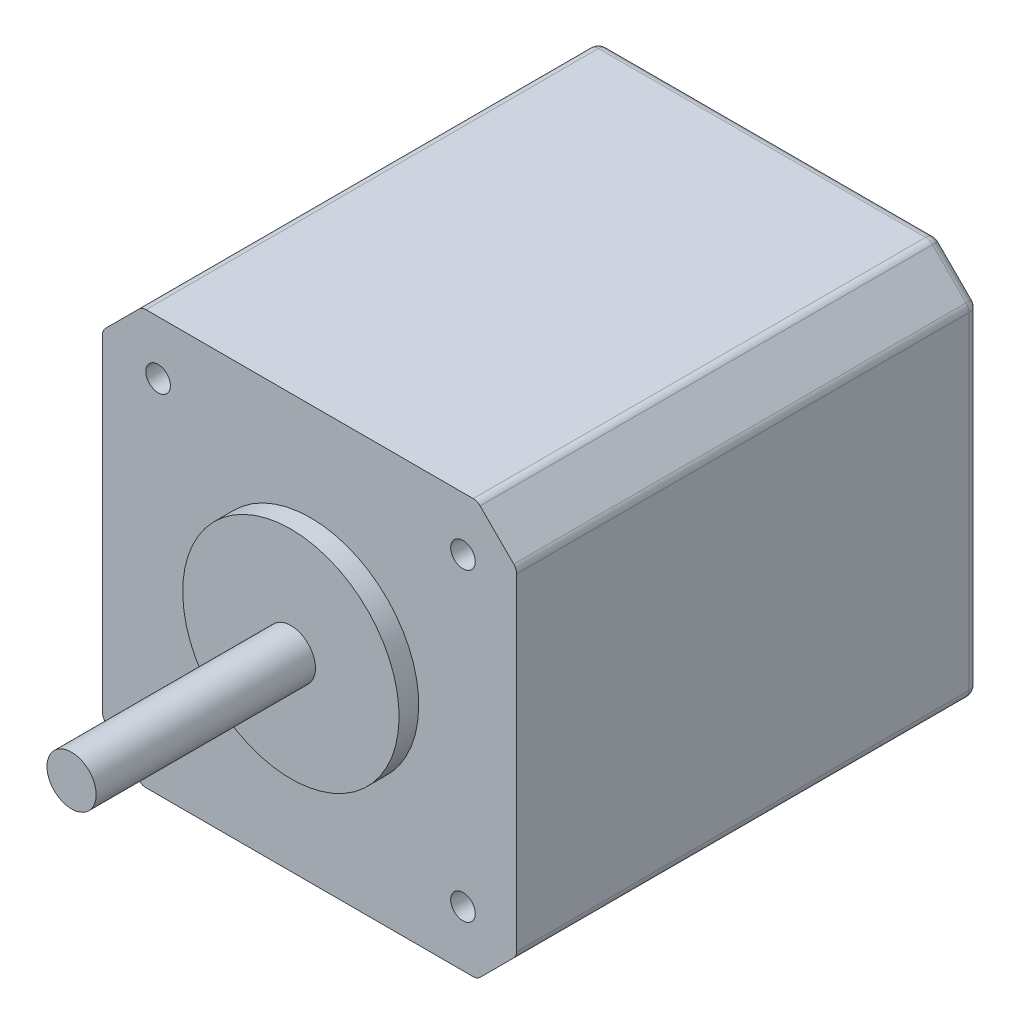
ISO-10303-21;
HEADER;
FILE_DESCRIPTION(('STEP AP214'),'2;1');
FILE_NAME('part.step','',(''),(''),'','','');
FILE_SCHEMA(('AUTOMOTIVE_DESIGN { 1 0 10303 214 1 1 1 1 }'));
ENDSEC;
DATA;
#1=APPLICATION_CONTEXT('core data for automotive mechanical design processes');
#2=APPLICATION_PROTOCOL_DEFINITION('international standard','automotive_design',2000,#1);
#3=PRODUCT_CONTEXT('',#1,'mechanical');
#4=PRODUCT('Part','Part','',(#3));
#5=PRODUCT_RELATED_PRODUCT_CATEGORY('part','',(#4));
#6=PRODUCT_DEFINITION_FORMATION('','',#4);
#7=PRODUCT_DEFINITION_CONTEXT('part definition',#1,'design');
#8=PRODUCT_DEFINITION('design','',#6,#7);
#9=PRODUCT_DEFINITION_SHAPE('','',#8);
#10=(LENGTH_UNIT() NAMED_UNIT(*) SI_UNIT(.MILLI.,.METRE.));
#11=(NAMED_UNIT(*) PLANE_ANGLE_UNIT() SI_UNIT($,.RADIAN.));
#12=(NAMED_UNIT(*) SI_UNIT($,.STERADIAN.) SOLID_ANGLE_UNIT());
#13=UNCERTAINTY_MEASURE_WITH_UNIT(LENGTH_MEASURE(1.E-05),#10,'distance_accuracy_value','');
#14=(GEOMETRIC_REPRESENTATION_CONTEXT(3) GLOBAL_UNCERTAINTY_ASSIGNED_CONTEXT((#13)) GLOBAL_UNIT_ASSIGNED_CONTEXT((#10,
#11,#12)) REPRESENTATION_CONTEXT('',''));
#15=CARTESIAN_POINT('',(0.,0.,0.));
#16=DIRECTION('',(0.,0.,1.));
#17=DIRECTION('',(1.,0.,0.));
#18=AXIS2_PLACEMENT_3D('',#15,#16,#17);
#19=CARTESIAN_POINT('',(18.62,18.62,71.3));
#20=DIRECTION('',(0.,0.,1.));
#21=DIRECTION('',(1.,0.,0.));
#22=AXIS2_PLACEMENT_3D('',#19,#20,#21);
#23=PLANE('',#22);
#24=CARTESIAN_POINT('',(21.15,21.15,71.3));
#25=DIRECTION('',(0.,0.,-1.));
#26=DIRECTION('',(-1.,0.,0.));
#27=AXIS2_PLACEMENT_3D('',#24,#25,#26);
#28=CIRCLE('',#27,2.5);
#29=CARTESIAN_POINT('',(18.65,21.15,71.3));
#30=VERTEX_POINT('',#29);
#31=EDGE_CURVE('E20',#30,#30,#28,.F.);
#32=ORIENTED_EDGE('',*,*,#31,.T.);
#33=EDGE_LOOP('',(#32));
#34=FACE_BOUND('',#33,.T.);
#35=ADVANCED_FACE('F16',(#34),#23,.T.);
#36=CARTESIAN_POINT('',(4.4142135623731,1.,1.00000000037309));
#37=DIRECTION('',(0.,0.,1.));
#38=DIRECTION('',(-1.,0.,0.));
#39=AXIS2_PLACEMENT_3D('',#36,#37,#38);
#40=SPHERICAL_SURFACE('',#39,1.);
#41=CARTESIAN_POINT('',(4.4142135625166,0.999999999515593,1.));
#42=DIRECTION('',(0.707106781187048,-0.707106781186047,0.));
#43=DIRECTION('',(0.707106781186044,0.707106781187051,0.));
#44=AXIS2_PLACEMENT_3D('',#41,#42,#43);
#45=CIRCLE('',#44,1.00000000042052);
#46=CARTESIAN_POINT('',(3.70710678096166,0.29289321871116,1.));
#47=VERTEX_POINT('',#46);
#48=CARTESIAN_POINT('',(4.41421356245348,0.999999999085498,-2.10262417285974E-10));
#49=VERTEX_POINT('',#48);
#50=EDGE_CURVE('E341',#47,#49,#45,.T.);
#51=ORIENTED_EDGE('',*,*,#50,.T.);
#52=CARTESIAN_POINT('',(4.414213562,1.,1.));
#53=DIRECTION('',(-1.,0.,0.));
#54=DIRECTION('',(0.,0.,1.));
#55=AXIS2_PLACEMENT_3D('',#52,#53,#54);
#56=CIRCLE('',#55,1.);
#57=CARTESIAN_POINT('',(4.41421356209617,0.,1.));
#58=VERTEX_POINT('',#57);
#59=EDGE_CURVE('E357',#49,#58,#56,.T.);
#60=ORIENTED_EDGE('',*,*,#59,.T.);
#61=CARTESIAN_POINT('',(4.414213562,1.,1.));
#62=DIRECTION('',(0.,0.,-1.));
#63=DIRECTION('',(-1.,0.,0.));
#64=AXIS2_PLACEMENT_3D('',#61,#62,#63);
#65=CIRCLE('',#64,1.);
#66=EDGE_CURVE('E94',#58,#47,#65,.T.);
#67=ORIENTED_EDGE('',*,*,#66,.T.);
#68=EDGE_LOOP('',(#51,#60,#67));
#69=FACE_BOUND('',#68,.T.);
#70=ADVANCED_FACE('F428',(#69),#40,.T.);
#71=CARTESIAN_POINT('',(0.999999999626884,4.41421356237311,1.));
#72=DIRECTION('',(0.,0.,1.));
#73=DIRECTION('',(-1.,0.,0.));
#74=AXIS2_PLACEMENT_3D('',#71,#72,#73);
#75=SPHERICAL_SURFACE('',#74,1.);
#76=CARTESIAN_POINT('',(1.,4.414213562,1.));
#77=DIRECTION('',(0.,1.,0.));
#78=DIRECTION('',(0.,0.,1.));
#79=AXIS2_PLACEMENT_3D('',#76,#77,#78);
#80=CIRCLE('',#79,1.);
#81=CARTESIAN_POINT('',(0.,4.414213562,1.));
#82=VERTEX_POINT('',#81);
#83=CARTESIAN_POINT('',(0.999999999415981,4.41421356290808,-2.11969873077644E-10));
#84=VERTEX_POINT('',#83);
#85=EDGE_CURVE('E323',#82,#84,#80,.F.);
#86=ORIENTED_EDGE('',*,*,#85,.T.);
#87=CARTESIAN_POINT('',(0.999999999514185,4.41421356251318,1.));
#88=DIRECTION('',(0.707106781187048,-0.707106781186047,0.));
#89=DIRECTION('',(0.707106781186045,0.70710678118705,0.));
#90=AXIS2_PLACEMENT_3D('',#87,#88,#89);
#91=CIRCLE('',#90,1.00000000042394);
#92=CARTESIAN_POINT('',(0.292893218650336,3.70710678102007,1.));
#93=VERTEX_POINT('',#92);
#94=EDGE_CURVE('E93',#84,#93,#91,.F.);
#95=ORIENTED_EDGE('',*,*,#94,.T.);
#96=CARTESIAN_POINT('',(1.,4.414213562,1.));
#97=DIRECTION('',(0.,0.,1.));
#98=DIRECTION('',(1.,0.,0.));
#99=AXIS2_PLACEMENT_3D('',#96,#97,#98);
#100=CIRCLE('',#99,1.);
#101=EDGE_CURVE('E312',#93,#82,#100,.F.);
#102=ORIENTED_EDGE('',*,*,#101,.T.);
#103=EDGE_LOOP('',(#86,#95,#102));
#104=FACE_BOUND('',#103,.T.);
#105=ADVANCED_FACE('F425',(#104),#75,.T.);
#106=CARTESIAN_POINT('',(1.00000000037312,37.6857864376269,0.999999999999998));
#107=DIRECTION('',(0.,0.,1.));
#108=DIRECTION('',(-1.,0.,0.));
#109=AXIS2_PLACEMENT_3D('',#106,#107,#108);
#110=SPHERICAL_SURFACE('',#109,1.);
#111=CARTESIAN_POINT('',(0.999999999500705,37.6857864374983,1.));
#112=DIRECTION('',(-0.707106781186047,-0.707106781187048,0.));
#113=DIRECTION('',(0.707106781187048,-0.707106781186048,0.));
#114=AXIS2_PLACEMENT_3D('',#111,#112,#113);
#115=CIRCLE('',#114,1.00000000044159);
#116=CARTESIAN_POINT('',(0.292893218633456,38.3928932189755,0.999999999999999));
#117=VERTEX_POINT('',#116);
#118=CARTESIAN_POINT('',(0.999999999409241,37.6857864378852,-2.20792405625919E-10));
#119=VERTEX_POINT('',#118);
#120=EDGE_CURVE('E300',#117,#119,#115,.T.);
#121=ORIENTED_EDGE('',*,*,#120,.T.);
#122=CARTESIAN_POINT('',(1.,37.685786438,1.));
#123=DIRECTION('',(0.,1.,0.));
#124=DIRECTION('',(0.,0.,1.));
#125=AXIS2_PLACEMENT_3D('',#122,#123,#124);
#126=CIRCLE('',#125,1.);
#127=CARTESIAN_POINT('',(0.,37.685786438,1.));
#128=VERTEX_POINT('',#127);
#129=EDGE_CURVE('E326',#119,#128,#126,.T.);
#130=ORIENTED_EDGE('',*,*,#129,.T.);
#131=CARTESIAN_POINT('',(1.,37.685786438,1.));
#132=DIRECTION('',(0.,0.,-1.));
#133=DIRECTION('',(-1.,0.,0.));
#134=AXIS2_PLACEMENT_3D('',#131,#132,#133);
#135=CIRCLE('',#134,1.);
#136=EDGE_CURVE('E306',#128,#117,#135,.T.);
#137=ORIENTED_EDGE('',*,*,#136,.T.);
#138=EDGE_LOOP('',(#121,#130,#137));
#139=FACE_BOUND('',#138,.T.);
#140=ADVANCED_FACE('F402',(#139),#110,.T.);
#141=CARTESIAN_POINT('',(4.41421356237317,41.1,1.00000000037312));
#142=DIRECTION('',(0.,0.,1.));
#143=DIRECTION('',(-1.,0.,0.));
#144=AXIS2_PLACEMENT_3D('',#141,#142,#143);
#145=SPHERICAL_SURFACE('',#144,1.);
#146=CARTESIAN_POINT('',(4.414213562,41.1,1.));
#147=DIRECTION('',(0.,0.,1.));
#148=DIRECTION('',(1.,0.,0.));
#149=AXIS2_PLACEMENT_3D('',#146,#147,#148);
#150=CIRCLE('',#149,1.);
#151=CARTESIAN_POINT('',(3.70710678100351,41.807106781348,0.999999999897449));
#152=VERTEX_POINT('',#151);
#153=CARTESIAN_POINT('',(4.41421356194872,42.1,1.));
#154=VERTEX_POINT('',#153);
#155=EDGE_CURVE('E284',#152,#154,#150,.F.);
#156=ORIENTED_EDGE('',*,*,#155,.T.);
#157=CARTESIAN_POINT('',(4.414213562,41.1,1.));
#158=DIRECTION('',(1.,0.,0.));
#159=DIRECTION('',(0.,0.,-1.));
#160=AXIS2_PLACEMENT_3D('',#157,#158,#159);
#161=CIRCLE('',#160,1.);
#162=CARTESIAN_POINT('',(4.41421356211314,41.1000000003864,-2.22496120919763E-10));
#163=VERTEX_POINT('',#162);
#164=EDGE_CURVE('E253',#154,#163,#161,.F.);
#165=ORIENTED_EDGE('',*,*,#164,.T.);
#166=CARTESIAN_POINT('',(4.41421356249829,41.1000000005007,1.));
#167=DIRECTION('',(-0.707106781186047,-0.707106781187048,0.));
#168=DIRECTION('',(0.707106781187049,-0.707106781186046,0.));
#169=AXIS2_PLACEMENT_3D('',#166,#167,#168);
#170=CIRCLE('',#169,1.00000000044499);
#171=EDGE_CURVE('E294',#163,#152,#170,.F.);
#172=ORIENTED_EDGE('',*,*,#171,.T.);
#173=EDGE_LOOP('',(#156,#165,#172));
#174=FACE_BOUND('',#173,.T.);
#175=ADVANCED_FACE('F397',(#174),#145,.T.);
#176=CARTESIAN_POINT('',(37.6857864376269,41.1,0.999999999626866));
#177=DIRECTION('',(0.,0.,1.));
#178=DIRECTION('',(-1.,0.,0.));
#179=AXIS2_PLACEMENT_3D('',#176,#177,#178);
#180=SPHERICAL_SURFACE('',#179,1.);
#181=CARTESIAN_POINT('',(37.685786438,41.1,1.));
#182=DIRECTION('',(0.,0.,-1.));
#183=DIRECTION('',(-1.,0.,0.));
#184=AXIS2_PLACEMENT_3D('',#181,#182,#183);
#185=CIRCLE('',#184,1.);
#186=CARTESIAN_POINT('',(37.6857864380769,42.1,1.00000000005128));
#187=VERTEX_POINT('',#186);
#188=CARTESIAN_POINT('',(38.3928932190532,41.8071067813037,1.));
#189=VERTEX_POINT('',#188);
#190=EDGE_CURVE('E249',#187,#189,#185,.T.);
#191=ORIENTED_EDGE('',*,*,#190,.T.);
#192=CARTESIAN_POINT('',(37.6857864375132,41.1000000005142,1.));
#193=DIRECTION('',(-0.707106781187048,0.707106781186047,0.));
#194=DIRECTION('',(-0.707106781186048,-0.707106781187047,0.));
#195=AXIS2_PLACEMENT_3D('',#192,#193,#194);
#196=CIRCLE('',#195,1.00000000046263);
#197=CARTESIAN_POINT('',(37.6857864378926,41.1000000003931,-2.31315997172715E-10));
#198=VERTEX_POINT('',#197);
#199=EDGE_CURVE('E246',#189,#198,#196,.T.);
#200=ORIENTED_EDGE('',*,*,#199,.T.);
#201=CARTESIAN_POINT('',(37.685786438,41.1,1.));
#202=DIRECTION('',(1.,0.,0.));
#203=DIRECTION('',(0.,0.,-1.));
#204=AXIS2_PLACEMENT_3D('',#201,#202,#203);
#205=CIRCLE('',#204,1.);
#206=EDGE_CURVE('E274',#198,#187,#205,.T.);
#207=ORIENTED_EDGE('',*,*,#206,.T.);
#208=EDGE_LOOP('',(#191,#200,#207));
#209=FACE_BOUND('',#208,.T.);
#210=ADVANCED_FACE('F394',(#209),#180,.T.);
#211=CARTESIAN_POINT('',(41.1000000003731,37.6857864376269,1.00000000000003));
#212=DIRECTION('',(0.,0.,1.));
#213=DIRECTION('',(-1.,0.,0.));
#214=AXIS2_PLACEMENT_3D('',#211,#212,#213);
#215=SPHERICAL_SURFACE('',#214,1.);
#216=CARTESIAN_POINT('',(41.1,37.685786438,1.));
#217=DIRECTION('',(0.,0.,1.));
#218=DIRECTION('',(1.,0.,0.));
#219=AXIS2_PLACEMENT_3D('',#216,#217,#218);
#220=CIRCLE('',#219,1.);
#221=CARTESIAN_POINT('',(41.8071067814371,38.3928932189223,1.));
#222=VERTEX_POINT('',#221);
#223=CARTESIAN_POINT('',(42.1,37.685786438,1.));
#224=VERTEX_POINT('',#223);
#225=EDGE_CURVE('E243',#222,#224,#220,.F.);
#226=ORIENTED_EDGE('',*,*,#225,.T.);
#227=CARTESIAN_POINT('',(41.1,37.685786438,1.));
#228=DIRECTION('',(0.,-1.,0.));
#229=DIRECTION('',(0.,0.,-1.));
#230=AXIS2_PLACEMENT_3D('',#227,#228,#229);
#231=CIRCLE('',#230,1.);
#232=CARTESIAN_POINT('',(41.1000000003938,37.6857864378943,-2.3302323612362E-10));
#233=VERTEX_POINT('',#232);
#234=EDGE_CURVE('E237',#224,#233,#231,.F.);
#235=ORIENTED_EDGE('',*,*,#234,.T.);
#236=CARTESIAN_POINT('',(41.1000000005156,37.6857864375166,1.));
#237=DIRECTION('',(-0.707106781187048,0.707106781186047,0.));
#238=DIRECTION('',(-0.707106781186048,-0.707106781187047,0.));
#239=AXIS2_PLACEMENT_3D('',#236,#237,#238);
#240=CIRCLE('',#239,1.00000000046605);
#241=EDGE_CURVE('E262',#233,#222,#240,.F.);
#242=ORIENTED_EDGE('',*,*,#241,.T.);
#243=EDGE_LOOP('',(#226,#235,#242));
#244=FACE_BOUND('',#243,.T.);
#245=ADVANCED_FACE('F379',(#244),#215,.T.);
#246=CARTESIAN_POINT('',(37.6857864376269,0.999999999999998,0.999999999626908));
#247=DIRECTION('',(0.,0.,1.));
#248=DIRECTION('',(-1.,0.,0.));
#249=AXIS2_PLACEMENT_3D('',#246,#247,#248);
#250=SPHERICAL_SURFACE('',#249,1.);
#251=CARTESIAN_POINT('',(37.685786438,1.,1.));
#252=DIRECTION('',(-1.,0.,0.));
#253=DIRECTION('',(0.,0.,1.));
#254=AXIS2_PLACEMENT_3D('',#251,#252,#253);
#255=CIRCLE('',#254,1.);
#256=CARTESIAN_POINT('',(37.6857864378558,0.,1.));
#257=VERTEX_POINT('',#256);
#258=CARTESIAN_POINT('',(37.6857864375556,0.999999999077222,-2.22500349308568E-10));
#259=VERTEX_POINT('',#258);
#260=EDGE_CURVE('E354',#257,#259,#255,.F.);
#261=ORIENTED_EDGE('',*,*,#260,.T.);
#262=CARTESIAN_POINT('',(37.6857864375017,0.99999999949929,1.));
#263=DIRECTION('',(0.707106781186047,0.707106781187048,0.));
#264=DIRECTION('',(-0.707106781187047,0.707106781186048,0.));
#265=AXIS2_PLACEMENT_3D('',#262,#263,#264);
#266=CIRCLE('',#265,1.000000000445);
#267=CARTESIAN_POINT('',(38.3928932189539,0.292893218609446,0.999999999999999));
#268=VERTEX_POINT('',#267);
#269=EDGE_CURVE('E215',#259,#268,#266,.F.);
#270=ORIENTED_EDGE('',*,*,#269,.T.);
#271=CARTESIAN_POINT('',(37.685786438,1.,1.));
#272=DIRECTION('',(0.,0.,1.));
#273=DIRECTION('',(1.,0.,0.));
#274=AXIS2_PLACEMENT_3D('',#271,#272,#273);
#275=CIRCLE('',#274,1.);
#276=EDGE_CURVE('E218',#268,#257,#275,.F.);
#277=ORIENTED_EDGE('',*,*,#276,.T.);
#278=EDGE_LOOP('',(#261,#270,#277));
#279=FACE_BOUND('',#278,.T.);
#280=ADVANCED_FACE('F372',(#279),#250,.T.);
#281=CARTESIAN_POINT('',(41.0999999996269,4.4142135623731,0.999999999999972));
#282=DIRECTION('',(0.,0.,1.));
#283=DIRECTION('',(-1.,0.,0.));
#284=AXIS2_PLACEMENT_3D('',#281,#282,#283);
#285=SPHERICAL_SURFACE('',#284,1.);
#286=CARTESIAN_POINT('',(41.1,4.414213562,1.));
#287=DIRECTION('',(0.,-1.,0.));
#288=DIRECTION('',(0.,0.,-1.));
#289=AXIS2_PLACEMENT_3D('',#286,#287,#288);
#290=CIRCLE('',#289,1.);
#291=CARTESIAN_POINT('',(41.1000000003857,4.41421356211485,-2.20790833532769E-10));
#292=VERTEX_POINT('',#291);
#293=CARTESIAN_POINT('',(42.1,4.41421356184617,1.00000000005128));
#294=VERTEX_POINT('',#293);
#295=EDGE_CURVE('E221',#292,#294,#290,.T.);
#296=ORIENTED_EDGE('',*,*,#295,.T.);
#297=CARTESIAN_POINT('',(41.1,4.414213562,1.));
#298=DIRECTION('',(0.,0.,-1.));
#299=DIRECTION('',(-1.,0.,0.));
#300=AXIS2_PLACEMENT_3D('',#297,#298,#299);
#301=CIRCLE('',#300,1.);
#302=CARTESIAN_POINT('',(41.8071067812963,3.70710678095422,0.999999999999999));
#303=VERTEX_POINT('',#302);
#304=EDGE_CURVE('E200',#294,#303,#301,.T.);
#305=ORIENTED_EDGE('',*,*,#304,.T.);
#306=CARTESIAN_POINT('',(41.1000000004993,4.41421356250171,1.));
#307=DIRECTION('',(0.707106781186047,0.707106781187048,0.));
#308=DIRECTION('',(-0.707106781187049,0.707106781186046,0.));
#309=AXIS2_PLACEMENT_3D('',#306,#307,#308);
#310=CIRCLE('',#309,1.00000000044158);
#311=EDGE_CURVE('E211',#303,#292,#310,.T.);
#312=ORIENTED_EDGE('',*,*,#311,.T.);
#313=EDGE_LOOP('',(#296,#305,#312));
#314=FACE_BOUND('',#313,.T.);
#315=ADVANCED_FACE('F367',(#314),#285,.T.);
#316=CARTESIAN_POINT('',(41.1,1.,0.));
#317=DIRECTION('',(0.,0.,-1.));
#318=DIRECTION('',(-1.,0.,0.));
#319=AXIS2_PLACEMENT_3D('',#316,#317,#318);
#320=PLANE('',#319);
#321=DIRECTION('',(-1.,0.,0.));
#322=VECTOR('',#321,1.);
#323=CARTESIAN_POINT('',(21.05,41.1,0.));
#324=LINE('',#323,#322);
#325=EDGE_CURVE('E277',#163,#198,#324,.F.);
#326=ORIENTED_EDGE('',*,*,#325,.T.);
#327=DIRECTION('',(-0.707106781187048,0.707106781186047,7.07049254735299E-13));
#328=VECTOR('',#327,1.);
#329=CARTESIAN_POINT('',(39.3928932192864,39.3928932192874,-4.64336902261664E-10));
#330=LINE('',#329,#328);
#331=EDGE_CURVE('E267',#198,#233,#330,.F.);
#332=ORIENTED_EDGE('',*,*,#331,.T.);
#333=DIRECTION('',(0.,1.,0.));
#334=VECTOR('',#333,1.);
#335=CARTESIAN_POINT('',(41.1,21.05,0.));
#336=LINE('',#335,#334);
#337=EDGE_CURVE('E234',#233,#292,#336,.F.);
#338=ORIENTED_EDGE('',*,*,#337,.T.);
#339=DIRECTION('',(0.707106781186048,0.707106781187047,7.08486346716469E-13));
#340=VECTOR('',#339,1.);
#341=CARTESIAN_POINT('',(39.3928932192725,2.70710678072848,-4.43291237051113E-10));
#342=LINE('',#341,#340);
#343=EDGE_CURVE('E214',#292,#259,#342,.F.);
#344=ORIENTED_EDGE('',*,*,#343,.T.);
#345=DIRECTION('',(1.,0.,0.));
#346=VECTOR('',#345,1.);
#347=CARTESIAN_POINT('',(21.05,0.999999999589793,0.));
#348=LINE('',#347,#346);
#349=EDGE_CURVE('E334',#259,#49,#348,.F.);
#350=ORIENTED_EDGE('',*,*,#349,.T.);
#351=DIRECTION('',(0.707106781187048,-0.707106781186047,7.07228891232946E-13));
#352=VECTOR('',#351,1.);
#353=CARTESIAN_POINT('',(2.70710678074338,2.70710678074237,-4.22232127733624E-10));
#354=LINE('',#353,#352);
#355=EDGE_CURVE('E316',#49,#84,#354,.F.);
#356=ORIENTED_EDGE('',*,*,#355,.T.);
#357=DIRECTION('',(0.,-1.,0.));
#358=VECTOR('',#357,1.);
#359=CARTESIAN_POINT('',(0.999999999589793,21.05,0.));
#360=LINE('',#359,#358);
#361=EDGE_CURVE('E309',#84,#119,#360,.F.);
#362=ORIENTED_EDGE('',*,*,#361,.T.);
#363=DIRECTION('',(-0.707106781186048,-0.707106781187047,7.05612162754131E-13));
#364=VECTOR('',#363,1.);
#365=CARTESIAN_POINT('',(2.70710678072748,39.3928932192715,-4.43287767604161E-10));
#366=LINE('',#365,#364);
#367=EDGE_CURVE('E297',#119,#163,#366,.F.);
#368=ORIENTED_EDGE('',*,*,#367,.T.);
#369=EDGE_LOOP('',(#326,#332,#338,#344,#350,#356,#362,#368));
#370=FACE_BOUND('',#369,.T.);
#371=ADVANCED_FACE('F371',(#370),#320,.T.);
#372=CARTESIAN_POINT('',(21.15,21.15,71.3));
#373=DIRECTION('',(0.,0.,-1.));
#374=DIRECTION('',(-1.,0.,0.));
#375=AXIS2_PLACEMENT_3D('',#372,#373,#374);
#376=CYLINDRICAL_SURFACE('',#375,2.5);
#377=CARTESIAN_POINT('',(21.15,21.15,49.));
#378=DIRECTION('',(0.,0.,-1.));
#379=DIRECTION('',(-1.,0.,0.));
#380=AXIS2_PLACEMENT_3D('',#377,#378,#379);
#381=CIRCLE('',#380,2.5);
#382=CARTESIAN_POINT('',(18.65,21.15,49.));
#383=VERTEX_POINT('',#382);
#384=EDGE_CURVE('E105',#383,#383,#381,.T.);
#385=ORIENTED_EDGE('',*,*,#384,.F.);
#386=EDGE_LOOP('',(#385));
#387=FACE_BOUND('',#386,.T.);
#388=ORIENTED_EDGE('',*,*,#31,.F.);
#389=EDGE_LOOP('',(#388));
#390=FACE_BOUND('',#389,.T.);
#391=ADVANCED_FACE('F374',(#387,#390),#376,.T.);
#392=CARTESIAN_POINT('',(37.685786438,1.,1.));
#393=DIRECTION('',(-1.,0.,0.));
#394=DIRECTION('',(0.,-1.,0.));
#395=AXIS2_PLACEMENT_3D('',#392,#393,#394);
#396=CYLINDRICAL_SURFACE('',#395,1.);
#397=ORIENTED_EDGE('',*,*,#260,.F.);
#398=DIRECTION('',(-1.,0.,0.));
#399=VECTOR('',#398,1.);
#400=CARTESIAN_POINT('',(21.05,0.,1.));
#401=LINE('',#400,#399);
#402=EDGE_CURVE('E192',#257,#58,#401,.T.);
#403=ORIENTED_EDGE('',*,*,#402,.T.);
#404=ORIENTED_EDGE('',*,*,#59,.F.);
#405=ORIENTED_EDGE('',*,*,#349,.F.);
#406=EDGE_LOOP('',(#397,#403,#404,#405));
#407=FACE_BOUND('',#406,.T.);
#408=ADVANCED_FACE('F574',(#407),#396,.T.);
#409=CARTESIAN_POINT('',(4.414213562,1.,47.));
#410=DIRECTION('',(0.,0.,-1.));
#411=DIRECTION('',(-1.,0.,0.));
#412=AXIS2_PLACEMENT_3D('',#409,#410,#411);
#413=CYLINDRICAL_SURFACE('',#412,1.);
#414=DIRECTION('',(0.,0.,-1.));
#415=VECTOR('',#414,1.);
#416=CARTESIAN_POINT('',(3.707106781,0.292893219,24.));
#417=LINE('',#416,#415);
#418=CARTESIAN_POINT('',(3.707106781,0.292893219,47.));
#419=VERTEX_POINT('',#418);
#420=EDGE_CURVE('E185',#419,#47,#417,.T.);
#421=ORIENTED_EDGE('',*,*,#420,.T.);
#422=ORIENTED_EDGE('',*,*,#66,.F.);
#423=DIRECTION('',(0.,0.,1.));
#424=VECTOR('',#423,1.);
#425=CARTESIAN_POINT('',(4.414213562,0.,24.));
#426=LINE('',#425,#424);
#427=CARTESIAN_POINT('',(4.414213562,0.,47.));
#428=VERTEX_POINT('',#427);
#429=EDGE_CURVE('E97',#58,#428,#426,.T.);
#430=ORIENTED_EDGE('',*,*,#429,.T.);
#431=CARTESIAN_POINT('',(4.414213562,1.,47.));
#432=DIRECTION('',(0.,0.,-1.));
#433=DIRECTION('',(-1.,0.,0.));
#434=AXIS2_PLACEMENT_3D('',#431,#432,#433);
#435=CIRCLE('',#434,1.);
#436=EDGE_CURVE('E84',#419,#428,#435,.F.);
#437=ORIENTED_EDGE('',*,*,#436,.F.);
#438=EDGE_LOOP('',(#421,#422,#430,#437));
#439=FACE_BOUND('',#438,.T.);
#440=ADVANCED_FACE('F98',(#439),#413,.T.);
#441=CARTESIAN_POINT('',(0.999999999514185,4.41421356251318,1.));
#442=DIRECTION('',(0.707106781187051,-0.707106781186044,0.));
#443=DIRECTION('',(0.707106781186044,0.707106781187051,0.));
#444=AXIS2_PLACEMENT_3D('',#441,#442,#443);
#445=CYLINDRICAL_SURFACE('',#444,1.00000000042222);
#446=ORIENTED_EDGE('',*,*,#50,.F.);
#447=DIRECTION('',(-0.707106781186548,0.707106781186548,0.));
#448=VECTOR('',#447,1.);
#449=CARTESIAN_POINT('',(2.,2.,1.));
#450=LINE('',#449,#448);
#451=EDGE_CURVE('E182',#47,#93,#450,.T.);
#452=ORIENTED_EDGE('',*,*,#451,.T.);
#453=ORIENTED_EDGE('',*,*,#94,.F.);
#454=ORIENTED_EDGE('',*,*,#355,.F.);
#455=EDGE_LOOP('',(#446,#452,#453,#454));
#456=FACE_BOUND('',#455,.T.);
#457=ADVANCED_FACE('F571',(#456),#445,.T.);
#458=CARTESIAN_POINT('',(1.,4.414213562,1.));
#459=DIRECTION('',(0.,0.,1.));
#460=DIRECTION('',(1.,0.,0.));
#461=AXIS2_PLACEMENT_3D('',#458,#459,#460);
#462=CYLINDRICAL_SURFACE('',#461,1.);
#463=DIRECTION('',(0.,0.,-1.));
#464=VECTOR('',#463,1.);
#465=CARTESIAN_POINT('',(0.,4.414213562,24.));
#466=LINE('',#465,#464);
#467=CARTESIAN_POINT('',(0.,4.414213562,47.));
#468=VERTEX_POINT('',#467);
#469=EDGE_CURVE('E174',#468,#82,#466,.T.);
#470=ORIENTED_EDGE('',*,*,#469,.T.);
#471=ORIENTED_EDGE('',*,*,#101,.F.);
#472=DIRECTION('',(0.,0.,1.));
#473=VECTOR('',#472,1.);
#474=CARTESIAN_POINT('',(0.292893219,3.707106781,24.));
#475=LINE('',#474,#473);
#476=CARTESIAN_POINT('',(0.292893219,3.707106781,47.));
#477=VERTEX_POINT('',#476);
#478=EDGE_CURVE('E187',#93,#477,#475,.T.);
#479=ORIENTED_EDGE('',*,*,#478,.T.);
#480=CARTESIAN_POINT('',(1.,4.414213562,47.));
#481=DIRECTION('',(0.,0.,1.));
#482=DIRECTION('',(1.,0.,0.));
#483=AXIS2_PLACEMENT_3D('',#480,#481,#482);
#484=CIRCLE('',#483,1.);
#485=EDGE_CURVE('E315',#468,#477,#484,.T.);
#486=ORIENTED_EDGE('',*,*,#485,.F.);
#487=EDGE_LOOP('',(#470,#471,#479,#486));
#488=FACE_BOUND('',#487,.T.);
#489=ADVANCED_FACE('F488',(#488),#462,.T.);
#490=CARTESIAN_POINT('',(1.,4.414213562,1.));
#491=DIRECTION('',(0.,1.,0.));
#492=DIRECTION('',(-1.,0.,0.));
#493=AXIS2_PLACEMENT_3D('',#490,#491,#492);
#494=CYLINDRICAL_SURFACE('',#493,1.);
#495=ORIENTED_EDGE('',*,*,#85,.F.);
#496=DIRECTION('',(0.,1.,0.));
#497=VECTOR('',#496,1.);
#498=CARTESIAN_POINT('',(0.,21.05,1.));
#499=LINE('',#498,#497);
#500=EDGE_CURVE('E167',#82,#128,#499,.T.);
#501=ORIENTED_EDGE('',*,*,#500,.T.);
#502=ORIENTED_EDGE('',*,*,#129,.F.);
#503=ORIENTED_EDGE('',*,*,#361,.F.);
#504=EDGE_LOOP('',(#495,#501,#502,#503));
#505=FACE_BOUND('',#504,.T.);
#506=ADVANCED_FACE('F556',(#505),#494,.T.);
#507=CARTESIAN_POINT('',(1.,37.685786438,47.));
#508=DIRECTION('',(0.,0.,-1.));
#509=DIRECTION('',(-1.,0.,0.));
#510=AXIS2_PLACEMENT_3D('',#507,#508,#509);
#511=CYLINDRICAL_SURFACE('',#510,1.);
#512=DIRECTION('',(0.,0.,-1.));
#513=VECTOR('',#512,1.);
#514=CARTESIAN_POINT('',(0.292893219,38.392893219,24.));
#515=LINE('',#514,#513);
#516=CARTESIAN_POINT('',(0.292893219,38.392893219,47.));
#517=VERTEX_POINT('',#516);
#518=EDGE_CURVE('E163',#517,#117,#515,.T.);
#519=ORIENTED_EDGE('',*,*,#518,.T.);
#520=ORIENTED_EDGE('',*,*,#136,.F.);
#521=DIRECTION('',(0.,0.,1.));
#522=VECTOR('',#521,1.);
#523=CARTESIAN_POINT('',(0.,37.685786438,24.));
#524=LINE('',#523,#522);
#525=CARTESIAN_POINT('',(0.,37.685786438,47.));
#526=VERTEX_POINT('',#525);
#527=EDGE_CURVE('E177',#128,#526,#524,.T.);
#528=ORIENTED_EDGE('',*,*,#527,.T.);
#529=CARTESIAN_POINT('',(1.,37.685786438,47.));
#530=DIRECTION('',(0.,0.,-1.));
#531=DIRECTION('',(-1.,0.,0.));
#532=AXIS2_PLACEMENT_3D('',#529,#530,#531);
#533=CIRCLE('',#532,1.);
#534=EDGE_CURVE('E303',#517,#526,#533,.F.);
#535=ORIENTED_EDGE('',*,*,#534,.F.);
#536=EDGE_LOOP('',(#519,#520,#528,#535));
#537=FACE_BOUND('',#536,.T.);
#538=ADVANCED_FACE('F625',(#537),#511,.T.);
#539=CARTESIAN_POINT('',(4.41421356249829,41.1000000005007,1.));
#540=DIRECTION('',(-0.707106781186048,-0.707106781187047,0.));
#541=DIRECTION('',(0.707106781187047,-0.707106781186048,0.));
#542=AXIS2_PLACEMENT_3D('',#539,#540,#541);
#543=CYLINDRICAL_SURFACE('',#542,1.00000000044329);
#544=ORIENTED_EDGE('',*,*,#367,.F.);
#545=ORIENTED_EDGE('',*,*,#120,.F.);
#546=DIRECTION('',(0.707106781186548,0.707106781186547,0.));
#547=VECTOR('',#546,1.);
#548=CARTESIAN_POINT('',(2.,40.1,1.));
#549=LINE('',#548,#547);
#550=EDGE_CURVE('E166',#117,#152,#549,.T.);
#551=ORIENTED_EDGE('',*,*,#550,.T.);
#552=ORIENTED_EDGE('',*,*,#171,.F.);
#553=EDGE_LOOP('',(#544,#545,#551,#552));
#554=FACE_BOUND('',#553,.T.);
#555=ADVANCED_FACE('F568',(#554),#543,.T.);
#556=CARTESIAN_POINT('',(4.414213562,41.1,1.));
#557=DIRECTION('',(0.,0.,1.));
#558=DIRECTION('',(1.,0.,0.));
#559=AXIS2_PLACEMENT_3D('',#556,#557,#558);
#560=CYLINDRICAL_SURFACE('',#559,1.);
#561=DIRECTION('',(0.,0.,1.));
#562=VECTOR('',#561,1.);
#563=CARTESIAN_POINT('',(3.707106781,41.807106781,24.));
#564=LINE('',#563,#562);
#565=CARTESIAN_POINT('',(3.707106781,41.807106781,47.));
#566=VERTEX_POINT('',#565);
#567=EDGE_CURVE('E156',#152,#566,#564,.T.);
#568=ORIENTED_EDGE('',*,*,#567,.T.);
#569=CARTESIAN_POINT('',(4.414213562,41.1,47.));
#570=DIRECTION('',(0.,0.,1.));
#571=DIRECTION('',(1.,0.,0.));
#572=AXIS2_PLACEMENT_3D('',#569,#570,#571);
#573=CIRCLE('',#572,1.);
#574=CARTESIAN_POINT('',(4.414213562,42.1,47.));
#575=VERTEX_POINT('',#574);
#576=EDGE_CURVE('E287',#575,#566,#573,.T.);
#577=ORIENTED_EDGE('',*,*,#576,.F.);
#578=DIRECTION('',(0.,0.,-1.));
#579=VECTOR('',#578,1.);
#580=CARTESIAN_POINT('',(4.414213562,42.1,24.));
#581=LINE('',#580,#579);
#582=EDGE_CURVE('E152',#575,#154,#581,.T.);
#583=ORIENTED_EDGE('',*,*,#582,.T.);
#584=ORIENTED_EDGE('',*,*,#155,.F.);
#585=EDGE_LOOP('',(#568,#577,#583,#584));
#586=FACE_BOUND('',#585,.T.);
#587=ADVANCED_FACE('F621',(#586),#560,.T.);
#588=CARTESIAN_POINT('',(4.414213562,41.1,1.));
#589=DIRECTION('',(1.,0.,0.));
#590=DIRECTION('',(0.,1.,0.));
#591=AXIS2_PLACEMENT_3D('',#588,#589,#590);
#592=CYLINDRICAL_SURFACE('',#591,1.);
#593=DIRECTION('',(1.,0.,0.));
#594=VECTOR('',#593,1.);
#595=CARTESIAN_POINT('',(21.05,42.1,1.));
#596=LINE('',#595,#594);
#597=EDGE_CURVE('E155',#154,#187,#596,.T.);
#598=ORIENTED_EDGE('',*,*,#597,.T.);
#599=ORIENTED_EDGE('',*,*,#206,.F.);
#600=ORIENTED_EDGE('',*,*,#325,.F.);
#601=ORIENTED_EDGE('',*,*,#164,.F.);
#602=EDGE_LOOP('',(#598,#599,#600,#601));
#603=FACE_BOUND('',#602,.T.);
#604=ADVANCED_FACE('F680',(#603),#592,.T.);
#605=CARTESIAN_POINT('',(37.685786438,41.1,47.));
#606=DIRECTION('',(0.,0.,-1.));
#607=DIRECTION('',(-1.,0.,0.));
#608=AXIS2_PLACEMENT_3D('',#605,#606,#607);
#609=CYLINDRICAL_SURFACE('',#608,1.);
#610=DIRECTION('',(0.,0.,-1.));
#611=VECTOR('',#610,1.);
#612=CARTESIAN_POINT('',(38.392893219,41.807106781,24.));
#613=LINE('',#612,#611);
#614=CARTESIAN_POINT('',(38.392893219,41.807106781,47.));
#615=VERTEX_POINT('',#614);
#616=EDGE_CURVE('E141',#615,#189,#613,.T.);
#617=ORIENTED_EDGE('',*,*,#616,.T.);
#618=ORIENTED_EDGE('',*,*,#190,.F.);
#619=DIRECTION('',(0.,0.,1.));
#620=VECTOR('',#619,1.);
#621=CARTESIAN_POINT('',(37.685786438,42.1,24.));
#622=LINE('',#621,#620);
#623=CARTESIAN_POINT('',(37.685786438,42.1,47.));
#624=VERTEX_POINT('',#623);
#625=EDGE_CURVE('E149',#187,#624,#622,.T.);
#626=ORIENTED_EDGE('',*,*,#625,.T.);
#627=CARTESIAN_POINT('',(37.685786438,41.1,47.));
#628=DIRECTION('',(0.,0.,-1.));
#629=DIRECTION('',(-1.,0.,0.));
#630=AXIS2_PLACEMENT_3D('',#627,#628,#629);
#631=CIRCLE('',#630,1.);
#632=EDGE_CURVE('E252',#615,#624,#631,.F.);
#633=ORIENTED_EDGE('',*,*,#632,.F.);
#634=EDGE_LOOP('',(#617,#618,#626,#633));
#635=FACE_BOUND('',#634,.T.);
#636=ADVANCED_FACE('F676',(#635),#609,.T.);
#637=CARTESIAN_POINT('',(41.1000000005156,37.6857864375166,1.));
#638=DIRECTION('',(-0.707106781187054,0.707106781186041,0.));
#639=DIRECTION('',(-0.707106781186041,-0.707106781187054,0.));
#640=AXIS2_PLACEMENT_3D('',#637,#638,#639);
#641=CYLINDRICAL_SURFACE('',#640,1.00000000046432);
#642=DIRECTION('',(0.707106781186548,-0.707106781186548,0.));
#643=VECTOR('',#642,1.);
#644=CARTESIAN_POINT('',(40.1,40.1,1.));
#645=LINE('',#644,#643);
#646=EDGE_CURVE('E135',#189,#222,#645,.T.);
#647=ORIENTED_EDGE('',*,*,#646,.T.);
#648=ORIENTED_EDGE('',*,*,#241,.F.);
#649=ORIENTED_EDGE('',*,*,#331,.F.);
#650=ORIENTED_EDGE('',*,*,#199,.F.);
#651=EDGE_LOOP('',(#647,#648,#649,#650));
#652=FACE_BOUND('',#651,.T.);
#653=ADVANCED_FACE('F673',(#652),#641,.T.);
#654=CARTESIAN_POINT('',(41.1,37.685786438,1.));
#655=DIRECTION('',(0.,0.,1.));
#656=DIRECTION('',(1.,0.,0.));
#657=AXIS2_PLACEMENT_3D('',#654,#655,#656);
#658=CYLINDRICAL_SURFACE('',#657,1.);
#659=DIRECTION('',(0.,0.,-1.));
#660=VECTOR('',#659,1.);
#661=CARTESIAN_POINT('',(42.1,37.685786438,24.));
#662=LINE('',#661,#660);
#663=CARTESIAN_POINT('',(42.1,37.685786438,47.));
#664=VERTEX_POINT('',#663);
#665=EDGE_CURVE('E131',#664,#224,#662,.T.);
#666=ORIENTED_EDGE('',*,*,#665,.T.);
#667=ORIENTED_EDGE('',*,*,#225,.F.);
#668=DIRECTION('',(0.,0.,1.));
#669=VECTOR('',#668,1.);
#670=CARTESIAN_POINT('',(41.807106781,38.392893219,24.));
#671=LINE('',#670,#669);
#672=CARTESIAN_POINT('',(41.807106781,38.392893219,47.));
#673=VERTEX_POINT('',#672);
#674=EDGE_CURVE('E144',#222,#673,#671,.T.);
#675=ORIENTED_EDGE('',*,*,#674,.T.);
#676=CARTESIAN_POINT('',(41.1,37.685786438,47.));
#677=DIRECTION('',(0.,0.,1.));
#678=DIRECTION('',(1.,0.,0.));
#679=AXIS2_PLACEMENT_3D('',#676,#677,#678);
#680=CIRCLE('',#679,1.);
#681=EDGE_CURVE('E240',#664,#673,#680,.T.);
#682=ORIENTED_EDGE('',*,*,#681,.F.);
#683=EDGE_LOOP('',(#666,#667,#675,#682));
#684=FACE_BOUND('',#683,.T.);
#685=ADVANCED_FACE('F604',(#684),#658,.T.);
#686=CARTESIAN_POINT('',(41.1,37.685786438,1.));
#687=DIRECTION('',(0.,-1.,0.));
#688=DIRECTION('',(1.,0.,0.));
#689=AXIS2_PLACEMENT_3D('',#686,#687,#688);
#690=CYLINDRICAL_SURFACE('',#689,1.);
#691=ORIENTED_EDGE('',*,*,#295,.F.);
#692=ORIENTED_EDGE('',*,*,#337,.F.);
#693=ORIENTED_EDGE('',*,*,#234,.F.);
#694=DIRECTION('',(0.,-1.,0.));
#695=VECTOR('',#694,1.);
#696=CARTESIAN_POINT('',(42.1,21.05,1.));
#697=LINE('',#696,#695);
#698=EDGE_CURVE('E134',#224,#294,#697,.T.);
#699=ORIENTED_EDGE('',*,*,#698,.T.);
#700=EDGE_LOOP('',(#691,#692,#693,#699));
#701=FACE_BOUND('',#700,.T.);
#702=ADVANCED_FACE('F599',(#701),#690,.T.);
#703=CARTESIAN_POINT('',(37.685786438,1.,1.));
#704=DIRECTION('',(0.,0.,1.));
#705=DIRECTION('',(1.,0.,0.));
#706=AXIS2_PLACEMENT_3D('',#703,#704,#705);
#707=CYLINDRICAL_SURFACE('',#706,1.);
#708=DIRECTION('',(0.,0.,-1.));
#709=VECTOR('',#708,1.);
#710=CARTESIAN_POINT('',(37.685786438,0.,24.));
#711=LINE('',#710,#709);
#712=CARTESIAN_POINT('',(37.685786438,0.,47.));
#713=VERTEX_POINT('',#712);
#714=EDGE_CURVE('E104',#713,#257,#711,.T.);
#715=ORIENTED_EDGE('',*,*,#714,.T.);
#716=ORIENTED_EDGE('',*,*,#276,.F.);
#717=DIRECTION('',(0.,0.,1.));
#718=VECTOR('',#717,1.);
#719=CARTESIAN_POINT('',(38.392893219,0.292893219,24.));
#720=LINE('',#719,#718);
#721=CARTESIAN_POINT('',(38.392893219,0.292893219000001,47.));
#722=VERTEX_POINT('',#721);
#723=EDGE_CURVE('E123',#268,#722,#720,.T.);
#724=ORIENTED_EDGE('',*,*,#723,.T.);
#725=CARTESIAN_POINT('',(37.685786438,1.,47.));
#726=DIRECTION('',(0.,0.,1.));
#727=DIRECTION('',(1.,0.,0.));
#728=AXIS2_PLACEMENT_3D('',#725,#726,#727);
#729=CIRCLE('',#728,1.);
#730=EDGE_CURVE('E203',#713,#722,#729,.T.);
#731=ORIENTED_EDGE('',*,*,#730,.F.);
#732=EDGE_LOOP('',(#715,#716,#724,#731));
#733=FACE_BOUND('',#732,.T.);
#734=ADVANCED_FACE('F577',(#733),#707,.T.);
#735=CARTESIAN_POINT('',(41.1,4.414213562,47.));
#736=DIRECTION('',(0.,0.,-1.));
#737=DIRECTION('',(-1.,0.,0.));
#738=AXIS2_PLACEMENT_3D('',#735,#736,#737);
#739=CYLINDRICAL_SURFACE('',#738,1.);
#740=DIRECTION('',(0.,0.,-1.));
#741=VECTOR('',#740,1.);
#742=CARTESIAN_POINT('',(41.807106781,3.707106781,24.));
#743=LINE('',#742,#741);
#744=CARTESIAN_POINT('',(41.807106781,3.707106781,47.));
#745=VERTEX_POINT('',#744);
#746=EDGE_CURVE('E120',#745,#303,#743,.T.);
#747=ORIENTED_EDGE('',*,*,#746,.T.);
#748=ORIENTED_EDGE('',*,*,#304,.F.);
#749=DIRECTION('',(0.,0.,1.));
#750=VECTOR('',#749,1.);
#751=CARTESIAN_POINT('',(42.1,4.414213562,24.));
#752=LINE('',#751,#750);
#753=CARTESIAN_POINT('',(42.1,4.414213562,47.));
#754=VERTEX_POINT('',#753);
#755=EDGE_CURVE('E128',#294,#754,#752,.T.);
#756=ORIENTED_EDGE('',*,*,#755,.T.);
#757=CARTESIAN_POINT('',(41.1,4.414213562,47.));
#758=DIRECTION('',(0.,0.,-1.));
#759=DIRECTION('',(-1.,0.,0.));
#760=AXIS2_PLACEMENT_3D('',#757,#758,#759);
#761=CIRCLE('',#760,1.);
#762=EDGE_CURVE('E35',#745,#754,#761,.F.);
#763=ORIENTED_EDGE('',*,*,#762,.F.);
#764=EDGE_LOOP('',(#747,#748,#756,#763));
#765=FACE_BOUND('',#764,.T.);
#766=ADVANCED_FACE('F586',(#765),#739,.T.);
#767=CARTESIAN_POINT('',(37.6857864375017,0.99999999949929,1.));
#768=DIRECTION('',(0.707106781186048,0.707106781187047,0.));
#769=DIRECTION('',(-0.707106781187047,0.707106781186048,0.));
#770=AXIS2_PLACEMENT_3D('',#767,#768,#769);
#771=CYLINDRICAL_SURFACE('',#770,1.00000000044329);
#772=ORIENTED_EDGE('',*,*,#311,.F.);
#773=DIRECTION('',(-0.707106781186547,-0.707106781186548,0.));
#774=VECTOR('',#773,1.);
#775=CARTESIAN_POINT('',(40.1,2.,1.));
#776=LINE('',#775,#774);
#777=EDGE_CURVE('E122',#303,#268,#776,.T.);
#778=ORIENTED_EDGE('',*,*,#777,.T.);
#779=ORIENTED_EDGE('',*,*,#269,.F.);
#780=ORIENTED_EDGE('',*,*,#343,.F.);
#781=EDGE_LOOP('',(#772,#778,#779,#780));
#782=FACE_BOUND('',#781,.T.);
#783=ADVANCED_FACE('F591',(#782),#771,.T.);
#784=CARTESIAN_POINT('',(35.385,4.385,40.));
#785=DIRECTION('',(0.,0.,1.));
#786=DIRECTION('',(1.,0.,0.));
#787=AXIS2_PLACEMENT_3D('',#784,#785,#786);
#788=PLANE('',#787);
#789=CARTESIAN_POINT('',(36.65,5.65,40.));
#790=DIRECTION('',(0.,0.,1.));
#791=DIRECTION('',(0.,-1.,0.));
#792=AXIS2_PLACEMENT_3D('',#789,#790,#791);
#793=CIRCLE('',#792,1.24999999999999);
#794=CARTESIAN_POINT('',(36.65,4.40000000000001,40.));
#795=VERTEX_POINT('',#794);
#796=EDGE_CURVE('E208',#795,#795,#793,.F.);
#797=ORIENTED_EDGE('',*,*,#796,.F.);
#798=EDGE_LOOP('',(#797));
#799=FACE_BOUND('',#798,.T.);
#800=ADVANCED_FACE('F664',(#799),#788,.T.);
#801=CARTESIAN_POINT('',(35.385,35.385,40.));
#802=DIRECTION('',(0.,0.,1.));
#803=DIRECTION('',(1.,0.,0.));
#804=AXIS2_PLACEMENT_3D('',#801,#802,#803);
#805=PLANE('',#804);
#806=CARTESIAN_POINT('',(36.65,36.65,40.));
#807=DIRECTION('',(0.,0.,1.));
#808=DIRECTION('',(0.,-1.,0.));
#809=AXIS2_PLACEMENT_3D('',#806,#807,#808);
#810=CIRCLE('',#809,1.24999999999999);
#811=CARTESIAN_POINT('',(36.65,35.4,40.));
#812=VERTEX_POINT('',#811);
#813=EDGE_CURVE('E469',#812,#812,#810,.F.);
#814=ORIENTED_EDGE('',*,*,#813,.F.);
#815=EDGE_LOOP('',(#814));
#816=FACE_BOUND('',#815,.T.);
#817=ADVANCED_FACE('F731',(#816),#805,.T.);
#818=CARTESIAN_POINT('',(4.385,35.385,40.));
#819=DIRECTION('',(0.,0.,1.));
#820=DIRECTION('',(1.,0.,0.));
#821=AXIS2_PLACEMENT_3D('',#818,#819,#820);
#822=PLANE('',#821);
#823=CARTESIAN_POINT('',(5.65,36.65,40.));
#824=DIRECTION('',(0.,0.,1.));
#825=DIRECTION('',(0.,-1.,0.));
#826=AXIS2_PLACEMENT_3D('',#823,#824,#825);
#827=CIRCLE('',#826,1.25);
#828=CARTESIAN_POINT('',(5.65,35.4,40.));
#829=VERTEX_POINT('',#828);
#830=EDGE_CURVE('E115',#829,#829,#827,.F.);
#831=ORIENTED_EDGE('',*,*,#830,.F.);
#832=EDGE_LOOP('',(#831));
#833=FACE_BOUND('',#832,.T.);
#834=ADVANCED_FACE('F739',(#833),#822,.T.);
#835=CARTESIAN_POINT('',(10.018,10.018,49.));
#836=DIRECTION('',(0.,0.,1.));
#837=DIRECTION('',(1.,0.,0.));
#838=AXIS2_PLACEMENT_3D('',#835,#836,#837);
#839=PLANE('',#838);
#840=ORIENTED_EDGE('',*,*,#384,.T.);
#841=EDGE_LOOP('',(#840));
#842=FACE_BOUND('',#841,.T.);
#843=CARTESIAN_POINT('',(21.15,21.15,49.));
#844=DIRECTION('',(0.,0.,-1.));
#845=DIRECTION('',(0.,1.,0.));
#846=AXIS2_PLACEMENT_3D('',#843,#844,#845);
#847=CIRCLE('',#846,11.);
#848=CARTESIAN_POINT('',(21.15,32.15,49.));
#849=VERTEX_POINT('',#848);
#850=EDGE_CURVE('E110',#849,#849,#847,.F.);
#851=ORIENTED_EDGE('',*,*,#850,.T.);
#852=EDGE_LOOP('',(#851));
#853=FACE_BOUND('',#852,.T.);
#854=ADVANCED_FACE('F747',(#842,#853),#839,.T.);
#855=CARTESIAN_POINT('',(4.414213562,0.,1.));
#856=DIRECTION('',(0.,1.,0.));
#857=DIRECTION('',(0.,0.,1.));
#858=AXIS2_PLACEMENT_3D('',#855,#856,#857);
#859=PLANE('',#858);
#860=ORIENTED_EDGE('',*,*,#714,.F.);
#861=DIRECTION('',(-1.,0.,0.));
#862=VECTOR('',#861,1.);
#863=CARTESIAN_POINT('',(21.05,0.,47.));
#864=LINE('',#863,#862);
#865=EDGE_CURVE('E90',#713,#428,#864,.T.);
#866=ORIENTED_EDGE('',*,*,#865,.T.);
#867=ORIENTED_EDGE('',*,*,#429,.F.);
#868=ORIENTED_EDGE('',*,*,#402,.F.);
#869=EDGE_LOOP('',(#860,#866,#867,#868));
#870=FACE_BOUND('',#869,.T.);
#871=ADVANCED_FACE('F108',(#870),#859,.F.);
#872=CARTESIAN_POINT('',(3.707106781,0.292893219,1.));
#873=DIRECTION('',(0.707106781186547,0.707106781186547,0.));
#874=DIRECTION('',(-0.707106781186547,0.707106781186547,0.));
#875=AXIS2_PLACEMENT_3D('',#872,#873,#874);
#876=PLANE('',#875);
#877=ORIENTED_EDGE('',*,*,#420,.F.);
#878=DIRECTION('',(-0.707106781186547,0.707106781186547,0.));
#879=VECTOR('',#878,1.);
#880=CARTESIAN_POINT('',(3.707106781,0.292893219,47.));
#881=LINE('',#880,#879);
#882=EDGE_CURVE('E92',#419,#477,#881,.T.);
#883=ORIENTED_EDGE('',*,*,#882,.T.);
#884=ORIENTED_EDGE('',*,*,#478,.F.);
#885=ORIENTED_EDGE('',*,*,#451,.F.);
#886=EDGE_LOOP('',(#877,#883,#884,#885));
#887=FACE_BOUND('',#886,.T.);
#888=ADVANCED_FACE('F492',(#887),#876,.F.);
#889=CARTESIAN_POINT('',(0.,4.414213562,47.));
#890=DIRECTION('',(1.,0.,0.));
#891=DIRECTION('',(0.,0.,-1.));
#892=AXIS2_PLACEMENT_3D('',#889,#890,#891);
#893=PLANE('',#892);
#894=ORIENTED_EDGE('',*,*,#469,.F.);
#895=DIRECTION('',(0.,1.,0.));
#896=VECTOR('',#895,1.);
#897=CARTESIAN_POINT('',(0.,21.05,47.));
#898=LINE('',#897,#896);
#899=EDGE_CURVE('E112',#468,#526,#898,.T.);
#900=ORIENTED_EDGE('',*,*,#899,.T.);
#901=ORIENTED_EDGE('',*,*,#527,.F.);
#902=ORIENTED_EDGE('',*,*,#500,.F.);
#903=EDGE_LOOP('',(#894,#900,#901,#902));
#904=FACE_BOUND('',#903,.T.);
#905=ADVANCED_FACE('F562',(#904),#893,.F.);
#906=CARTESIAN_POINT('',(0.292893219,38.392893219,1.));
#907=DIRECTION('',(0.707106781186547,-0.707106781186548,0.));
#908=DIRECTION('',(0.707106781186548,0.707106781186547,0.));
#909=AXIS2_PLACEMENT_3D('',#906,#907,#908);
#910=PLANE('',#909);
#911=ORIENTED_EDGE('',*,*,#567,.F.);
#912=ORIENTED_EDGE('',*,*,#550,.F.);
#913=ORIENTED_EDGE('',*,*,#518,.F.);
#914=DIRECTION('',(0.707106781186548,0.707106781186547,0.));
#915=VECTOR('',#914,1.);
#916=CARTESIAN_POINT('',(0.292893219,38.392893219,47.));
#917=LINE('',#916,#915);
#918=EDGE_CURVE('E464',#517,#566,#917,.T.);
#919=ORIENTED_EDGE('',*,*,#918,.T.);
#920=EDGE_LOOP('',(#911,#912,#913,#919));
#921=FACE_BOUND('',#920,.T.);
#922=ADVANCED_FACE('F624',(#921),#910,.F.);
#923=CARTESIAN_POINT('',(4.414213562,42.1,47.));
#924=DIRECTION('',(0.,-1.,0.));
#925=DIRECTION('',(0.,0.,-1.));
#926=AXIS2_PLACEMENT_3D('',#923,#924,#925);
#927=PLANE('',#926);
#928=ORIENTED_EDGE('',*,*,#625,.F.);
#929=ORIENTED_EDGE('',*,*,#597,.F.);
#930=ORIENTED_EDGE('',*,*,#582,.F.);
#931=DIRECTION('',(1.,0.,0.));
#932=VECTOR('',#931,1.);
#933=CARTESIAN_POINT('',(21.05,42.1,47.));
#934=LINE('',#933,#932);
#935=EDGE_CURVE('E463',#575,#624,#934,.T.);
#936=ORIENTED_EDGE('',*,*,#935,.T.);
#937=EDGE_LOOP('',(#928,#929,#930,#936));
#938=FACE_BOUND('',#937,.T.);
#939=ADVANCED_FACE('F616',(#938),#927,.F.);
#940=CARTESIAN_POINT('',(38.392893219,41.807106781,1.));
#941=DIRECTION('',(-0.707106781186547,-0.707106781186547,0.));
#942=DIRECTION('',(0.707106781186547,-0.707106781186547,0.));
#943=AXIS2_PLACEMENT_3D('',#940,#941,#942);
#944=PLANE('',#943);
#945=ORIENTED_EDGE('',*,*,#616,.F.);
#946=DIRECTION('',(0.707106781186547,-0.707106781186547,0.));
#947=VECTOR('',#946,1.);
#948=CARTESIAN_POINT('',(38.392893219,41.807106781,47.));
#949=LINE('',#948,#947);
#950=EDGE_CURVE('E460',#615,#673,#949,.T.);
#951=ORIENTED_EDGE('',*,*,#950,.T.);
#952=ORIENTED_EDGE('',*,*,#674,.F.);
#953=ORIENTED_EDGE('',*,*,#646,.F.);
#954=EDGE_LOOP('',(#945,#951,#952,#953));
#955=FACE_BOUND('',#954,.T.);
#956=ADVANCED_FACE('F608',(#955),#944,.F.);
#957=CARTESIAN_POINT('',(42.1,4.414213562,1.));
#958=DIRECTION('',(-1.,0.,0.));
#959=DIRECTION('',(0.,0.,1.));
#960=AXIS2_PLACEMENT_3D('',#957,#958,#959);
#961=PLANE('',#960);
#962=ORIENTED_EDGE('',*,*,#755,.F.);
#963=ORIENTED_EDGE('',*,*,#698,.F.);
#964=ORIENTED_EDGE('',*,*,#665,.F.);
#965=DIRECTION('',(0.,-1.,0.));
#966=VECTOR('',#965,1.);
#967=CARTESIAN_POINT('',(42.1,21.05,47.));
#968=LINE('',#967,#966);
#969=EDGE_CURVE('E459',#664,#754,#968,.T.);
#970=ORIENTED_EDGE('',*,*,#969,.T.);
#971=EDGE_LOOP('',(#962,#963,#964,#970));
#972=FACE_BOUND('',#971,.T.);
#973=ADVANCED_FACE('F597',(#972),#961,.F.);
#974=CARTESIAN_POINT('',(41.807106781,3.707106781,1.));
#975=DIRECTION('',(-0.707106781186548,0.707106781186547,0.));
#976=DIRECTION('',(-0.707106781186547,-0.707106781186548,0.));
#977=AXIS2_PLACEMENT_3D('',#974,#975,#976);
#978=PLANE('',#977);
#979=ORIENTED_EDGE('',*,*,#746,.F.);
#980=DIRECTION('',(-0.707106781186547,-0.707106781186548,0.));
#981=VECTOR('',#980,1.);
#982=CARTESIAN_POINT('',(41.807106781,3.707106781,47.));
#983=LINE('',#982,#981);
#984=EDGE_CURVE('E456',#745,#722,#983,.T.);
#985=ORIENTED_EDGE('',*,*,#984,.T.);
#986=ORIENTED_EDGE('',*,*,#723,.F.);
#987=ORIENTED_EDGE('',*,*,#777,.F.);
#988=EDGE_LOOP('',(#979,#985,#986,#987));
#989=FACE_BOUND('',#988,.T.);
#990=ADVANCED_FACE('F583',(#989),#978,.F.);
#991=CARTESIAN_POINT('',(36.65,5.65,40.));
#992=DIRECTION('',(0.,0.,1.));
#993=DIRECTION('',(0.,-1.,0.));
#994=AXIS2_PLACEMENT_3D('',#991,#992,#993);
#995=CYLINDRICAL_SURFACE('',#994,1.24999999999999);
#996=ORIENTED_EDGE('',*,*,#796,.T.);
#997=EDGE_LOOP('',(#996));
#998=FACE_BOUND('',#997,.T.);
#999=CARTESIAN_POINT('',(36.65,5.65000000000002,47.));
#1000=DIRECTION('',(0.,0.,1.));
#1001=DIRECTION('',(0.,-1.,0.));
#1002=AXIS2_PLACEMENT_3D('',#999,#1000,#1001);
#1003=CIRCLE('',#1002,1.24999999999999);
#1004=CARTESIAN_POINT('',(36.65,4.40000000000002,47.));
#1005=VERTEX_POINT('',#1004);
#1006=EDGE_CURVE('E453',#1005,#1005,#1003,.T.);
#1007=ORIENTED_EDGE('',*,*,#1006,.T.);
#1008=EDGE_LOOP('',(#1007));
#1009=FACE_BOUND('',#1008,.T.);
#1010=ADVANCED_FACE('F657',(#998,#1009),#995,.F.);
#1011=CARTESIAN_POINT('',(36.65,36.65,40.));
#1012=DIRECTION('',(0.,0.,1.));
#1013=DIRECTION('',(0.,-1.,0.));
#1014=AXIS2_PLACEMENT_3D('',#1011,#1012,#1013);
#1015=CYLINDRICAL_SURFACE('',#1014,1.24999999999999);
#1016=ORIENTED_EDGE('',*,*,#813,.T.);
#1017=EDGE_LOOP('',(#1016));
#1018=FACE_BOUND('',#1017,.T.);
#1019=CARTESIAN_POINT('',(36.65,36.65,47.));
#1020=DIRECTION('',(0.,0.,1.));
#1021=DIRECTION('',(0.,-1.,0.));
#1022=AXIS2_PLACEMENT_3D('',#1019,#1020,#1021);
#1023=CIRCLE('',#1022,1.24999999999999);
#1024=CARTESIAN_POINT('',(36.65,35.4,47.));
#1025=VERTEX_POINT('',#1024);
#1026=EDGE_CURVE('E450',#1025,#1025,#1023,.T.);
#1027=ORIENTED_EDGE('',*,*,#1026,.T.);
#1028=EDGE_LOOP('',(#1027));
#1029=FACE_BOUND('',#1028,.T.);
#1030=ADVANCED_FACE('F653',(#1018,#1029),#1015,.F.);
#1031=CARTESIAN_POINT('',(5.65,36.65,40.));
#1032=DIRECTION('',(0.,0.,1.));
#1033=DIRECTION('',(0.,-1.,0.));
#1034=AXIS2_PLACEMENT_3D('',#1031,#1032,#1033);
#1035=CYLINDRICAL_SURFACE('',#1034,1.25);
#1036=ORIENTED_EDGE('',*,*,#830,.T.);
#1037=EDGE_LOOP('',(#1036));
#1038=FACE_BOUND('',#1037,.T.);
#1039=CARTESIAN_POINT('',(5.65,36.65,47.));
#1040=DIRECTION('',(0.,0.,1.));
#1041=DIRECTION('',(0.,-1.,0.));
#1042=AXIS2_PLACEMENT_3D('',#1039,#1040,#1041);
#1043=CIRCLE('',#1042,1.25);
#1044=CARTESIAN_POINT('',(5.65,35.4,47.));
#1045=VERTEX_POINT('',#1044);
#1046=EDGE_CURVE('E447',#1045,#1045,#1043,.T.);
#1047=ORIENTED_EDGE('',*,*,#1046,.T.);
#1048=EDGE_LOOP('',(#1047));
#1049=FACE_BOUND('',#1048,.T.);
#1050=ADVANCED_FACE('F649',(#1038,#1049),#1035,.F.);
#1051=CARTESIAN_POINT('',(21.15,21.15,49.));
#1052=DIRECTION('',(0.,0.,-1.));
#1053=DIRECTION('',(0.,1.,0.));
#1054=AXIS2_PLACEMENT_3D('',#1051,#1052,#1053);
#1055=CYLINDRICAL_SURFACE('',#1054,11.);
#1056=ORIENTED_EDGE('',*,*,#850,.F.);
#1057=EDGE_LOOP('',(#1056));
#1058=FACE_BOUND('',#1057,.T.);
#1059=CARTESIAN_POINT('',(21.15,21.15,47.));
#1060=DIRECTION('',(0.,0.,-1.));
#1061=DIRECTION('',(0.,1.,0.));
#1062=AXIS2_PLACEMENT_3D('',#1059,#1060,#1061);
#1063=CIRCLE('',#1062,11.);
#1064=CARTESIAN_POINT('',(21.15,32.15,47.));
#1065=VERTEX_POINT('',#1064);
#1066=EDGE_CURVE('E444',#1065,#1065,#1063,.F.);
#1067=ORIENTED_EDGE('',*,*,#1066,.T.);
#1068=EDGE_LOOP('',(#1067));
#1069=FACE_BOUND('',#1068,.T.);
#1070=ADVANCED_FACE('F646',(#1058,#1069),#1055,.T.);
#1071=CARTESIAN_POINT('',(4.385,4.385,40.));
#1072=DIRECTION('',(0.,0.,1.));
#1073=DIRECTION('',(1.,0.,0.));
#1074=AXIS2_PLACEMENT_3D('',#1071,#1072,#1073);
#1075=PLANE('',#1074);
#1076=CARTESIAN_POINT('',(5.65,5.65,40.));
#1077=DIRECTION('',(0.,0.,1.));
#1078=DIRECTION('',(0.,-1.,0.));
#1079=AXIS2_PLACEMENT_3D('',#1076,#1077,#1078);
#1080=CIRCLE('',#1079,1.25);
#1081=CARTESIAN_POINT('',(5.65,4.4,40.));
#1082=VERTEX_POINT('',#1081);
#1083=EDGE_CURVE('E26',#1082,#1082,#1080,.F.);
#1084=ORIENTED_EDGE('',*,*,#1083,.F.);
#1085=EDGE_LOOP('',(#1084));
#1086=FACE_BOUND('',#1085,.T.);
#1087=ADVANCED_FACE('F642',(#1086),#1075,.T.);
#1088=CARTESIAN_POINT('',(42.1,0.,47.));
#1089=DIRECTION('',(0.,0.,-1.));
#1090=DIRECTION('',(-1.,0.,0.));
#1091=AXIS2_PLACEMENT_3D('',#1088,#1089,#1090);
#1092=PLANE('',#1091);
#1093=ORIENTED_EDGE('',*,*,#1066,.F.);
#1094=EDGE_LOOP('',(#1093));
#1095=FACE_BOUND('',#1094,.T.);
#1096=ORIENTED_EDGE('',*,*,#1046,.F.);
#1097=EDGE_LOOP('',(#1096));
#1098=FACE_BOUND('',#1097,.T.);
#1099=ORIENTED_EDGE('',*,*,#1026,.F.);
#1100=EDGE_LOOP('',(#1099));
#1101=FACE_BOUND('',#1100,.T.);
#1102=ORIENTED_EDGE('',*,*,#1006,.F.);
#1103=EDGE_LOOP('',(#1102));
#1104=FACE_BOUND('',#1103,.T.);
#1105=CARTESIAN_POINT('',(5.65,5.65000000000002,47.));
#1106=DIRECTION('',(0.,0.,1.));
#1107=DIRECTION('',(0.,-1.,0.));
#1108=AXIS2_PLACEMENT_3D('',#1105,#1106,#1107);
#1109=CIRCLE('',#1108,1.25);
#1110=CARTESIAN_POINT('',(5.65,4.40000000000002,47.));
#1111=VERTEX_POINT('',#1110);
#1112=EDGE_CURVE('E10',#1111,#1111,#1109,.T.);
#1113=ORIENTED_EDGE('',*,*,#1112,.F.);
#1114=EDGE_LOOP('',(#1113));
#1115=FACE_BOUND('',#1114,.T.);
#1116=ORIENTED_EDGE('',*,*,#762,.T.);
#1117=ORIENTED_EDGE('',*,*,#969,.F.);
#1118=ORIENTED_EDGE('',*,*,#681,.T.);
#1119=ORIENTED_EDGE('',*,*,#950,.F.);
#1120=ORIENTED_EDGE('',*,*,#632,.T.);
#1121=ORIENTED_EDGE('',*,*,#935,.F.);
#1122=ORIENTED_EDGE('',*,*,#576,.T.);
#1123=ORIENTED_EDGE('',*,*,#918,.F.);
#1124=ORIENTED_EDGE('',*,*,#534,.T.);
#1125=ORIENTED_EDGE('',*,*,#899,.F.);
#1126=ORIENTED_EDGE('',*,*,#485,.T.);
#1127=ORIENTED_EDGE('',*,*,#882,.F.);
#1128=ORIENTED_EDGE('',*,*,#436,.T.);
#1129=ORIENTED_EDGE('',*,*,#865,.F.);
#1130=ORIENTED_EDGE('',*,*,#730,.T.);
#1131=ORIENTED_EDGE('',*,*,#984,.F.);
#1132=EDGE_LOOP('',(#1116,#1117,#1118,#1119,#1120,#1121,#1122,#1123,#1124,#1125,#1126,#1127,
#1128,#1129,#1130,#1131));
#1133=FACE_BOUND('',#1132,.T.);
#1134=ADVANCED_FACE('F18',(#1095,#1098,#1101,#1104,#1115,#1133),#1092,.F.);
#1135=CARTESIAN_POINT('',(5.65,5.65,40.));
#1136=DIRECTION('',(0.,0.,1.));
#1137=DIRECTION('',(0.,-1.,0.));
#1138=AXIS2_PLACEMENT_3D('',#1135,#1136,#1137);
#1139=CYLINDRICAL_SURFACE('',#1138,1.25);
#1140=ORIENTED_EDGE('',*,*,#1112,.T.);
#1141=EDGE_LOOP('',(#1140));
#1142=FACE_BOUND('',#1141,.T.);
#1143=ORIENTED_EDGE('',*,*,#1083,.T.);
#1144=EDGE_LOOP('',(#1143));
#1145=FACE_BOUND('',#1144,.T.);
#1146=ADVANCED_FACE('F635',(#1142,#1145),#1139,.F.);
#1147=CLOSED_SHELL('',(#35,#70,#105,#140,#175,#210,#245,#280,#315,#371,#391,#408,#440,#457,#489,
#506,#538,#555,#587,#604,#636,#653,#685,#702,#734,#766,#783,#800,#817,#834,#854,#871,#888,#905,
#922,#939,#956,#973,#990,#1010,#1030,#1050,#1070,#1087,#1134,#1146));
#1148=MANIFOLD_SOLID_BREP('B1',#1147);
#1149=ADVANCED_BREP_SHAPE_REPRESENTATION('',(#18,#1148),#14);
#1150=SHAPE_DEFINITION_REPRESENTATION(#9,#1149);
ENDSEC;
END-ISO-10303-21;
